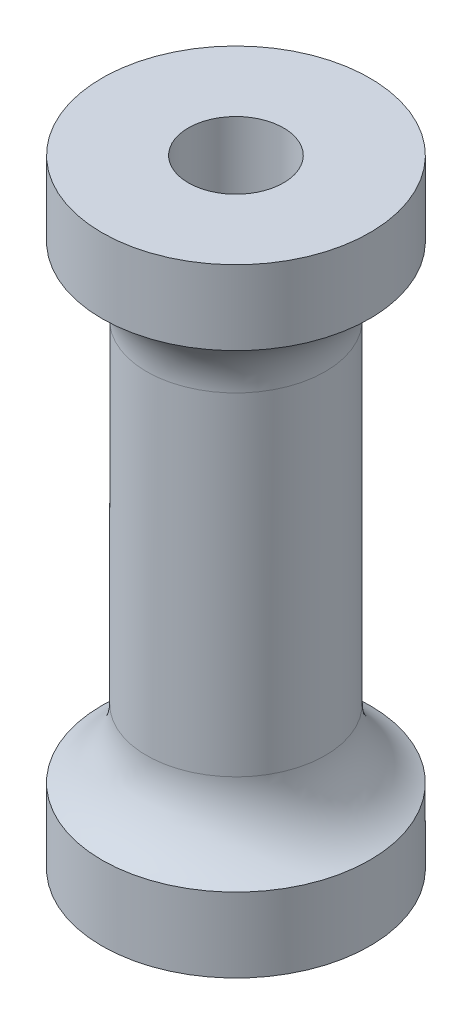
ISO-10303-21;
HEADER;
FILE_DESCRIPTION(('STEP AP214'),'2;1');
FILE_NAME('part.step','',(''),(''),'','','');
FILE_SCHEMA(('AUTOMOTIVE_DESIGN { 1 0 10303 214 1 1 1 1 }'));
ENDSEC;
DATA;
#1=APPLICATION_CONTEXT('core data for automotive mechanical design processes');
#2=APPLICATION_PROTOCOL_DEFINITION('international standard','automotive_design',2000,#1);
#3=PRODUCT_CONTEXT('',#1,'mechanical');
#4=PRODUCT('Part','Part','',(#3));
#5=PRODUCT_RELATED_PRODUCT_CATEGORY('part','',(#4));
#6=PRODUCT_DEFINITION_FORMATION('','',#4);
#7=PRODUCT_DEFINITION_CONTEXT('part definition',#1,'design');
#8=PRODUCT_DEFINITION('design','',#6,#7);
#9=PRODUCT_DEFINITION_SHAPE('','',#8);
#10=(LENGTH_UNIT() NAMED_UNIT(*) SI_UNIT(.MILLI.,.METRE.));
#11=(NAMED_UNIT(*) PLANE_ANGLE_UNIT() SI_UNIT($,.RADIAN.));
#12=(NAMED_UNIT(*) SI_UNIT($,.STERADIAN.) SOLID_ANGLE_UNIT());
#13=UNCERTAINTY_MEASURE_WITH_UNIT(LENGTH_MEASURE(1.E-05),#10,'distance_accuracy_value','');
#14=(GEOMETRIC_REPRESENTATION_CONTEXT(3) GLOBAL_UNCERTAINTY_ASSIGNED_CONTEXT((#13)) GLOBAL_UNIT_ASSIGNED_CONTEXT((#10,
#11,#12)) REPRESENTATION_CONTEXT('',''));
#15=CARTESIAN_POINT('',(0.,0.,0.));
#16=DIRECTION('',(0.,0.,1.));
#17=DIRECTION('',(1.,0.,0.));
#18=AXIS2_PLACEMENT_3D('',#15,#16,#17);
#19=CARTESIAN_POINT('',(0.,41.5,0.));
#20=DIRECTION('',(0.,-1.,0.));
#21=DIRECTION('',(0.,0.,-1.));
#22=AXIS2_PLACEMENT_3D('',#19,#20,#21);
#23=CYLINDRICAL_SURFACE('',#22,6.);
#24=CARTESIAN_POINT('',(0.,31.9174243050442,0.));
#25=DIRECTION('',(0.,1.,0.));
#26=DIRECTION('',(0.,0.,1.));
#27=AXIS2_PLACEMENT_3D('',#24,#25,#26);
#28=CIRCLE('',#27,6.);
#29=CARTESIAN_POINT('',(0.,31.9174243050442,6.));
#30=VERTEX_POINT('',#29);
#31=EDGE_CURVE('E10',#30,#30,#28,.F.);
#32=ORIENTED_EDGE('',*,*,#31,.T.);
#33=EDGE_LOOP('',(#32));
#34=FACE_BOUND('',#33,.T.);
#35=CARTESIAN_POINT('',(0.,9.58257569495584,0.));
#36=DIRECTION('',(0.,-1.,0.));
#37=DIRECTION('',(0.,0.,-1.));
#38=AXIS2_PLACEMENT_3D('',#35,#36,#37);
#39=CIRCLE('',#38,6.);
#40=CARTESIAN_POINT('',(0.,9.58257569495584,-6.));
#41=VERTEX_POINT('',#40);
#42=EDGE_CURVE('E46',#41,#41,#39,.F.);
#43=ORIENTED_EDGE('',*,*,#42,.T.);
#44=EDGE_LOOP('',(#43));
#45=FACE_BOUND('',#44,.T.);
#46=ADVANCED_FACE('F39',(#34,#45),#23,.T.);
#47=CARTESIAN_POINT('',(0.,41.5,0.));
#48=DIRECTION('',(0.,1.,0.));
#49=DIRECTION('',(0.,0.,1.));
#50=AXIS2_PLACEMENT_3D('',#47,#48,#49);
#51=PLANE('',#50);
#52=CARTESIAN_POINT('',(0.,41.5,0.));
#53=DIRECTION('',(0.,1.,0.));
#54=DIRECTION('',(0.,0.,1.));
#55=AXIS2_PLACEMENT_3D('',#52,#53,#54);
#56=CIRCLE('',#55,3.2);
#57=CARTESIAN_POINT('',(0.,41.5,3.2));
#58=VERTEX_POINT('',#57);
#59=EDGE_CURVE('E50',#58,#58,#56,.T.);
#60=ORIENTED_EDGE('',*,*,#59,.F.);
#61=EDGE_LOOP('',(#60));
#62=FACE_BOUND('',#61,.T.);
#63=CARTESIAN_POINT('',(0.,41.5,0.));
#64=DIRECTION('',(0.,1.,0.));
#65=DIRECTION('',(0.,0.,1.));
#66=AXIS2_PLACEMENT_3D('',#63,#64,#65);
#67=CIRCLE('',#66,9.);
#68=CARTESIAN_POINT('',(0.,41.5,9.));
#69=VERTEX_POINT('',#68);
#70=EDGE_CURVE('E58',#69,#69,#67,.T.);
#71=ORIENTED_EDGE('',*,*,#70,.T.);
#72=EDGE_LOOP('',(#71));
#73=FACE_BOUND('',#72,.T.);
#74=ADVANCED_FACE('F84',(#62,#73),#51,.T.);
#75=CARTESIAN_POINT('',(0.,0.,0.));
#76=DIRECTION('',(0.,1.,0.));
#77=DIRECTION('',(0.,0.,1.));
#78=AXIS2_PLACEMENT_3D('',#75,#76,#77);
#79=PLANE('',#78);
#80=CARTESIAN_POINT('',(0.,0.,0.));
#81=DIRECTION('',(0.,1.,0.));
#82=DIRECTION('',(0.,0.,1.));
#83=AXIS2_PLACEMENT_3D('',#80,#81,#82);
#84=CIRCLE('',#83,3.2);
#85=CARTESIAN_POINT('',(0.,0.,3.2));
#86=VERTEX_POINT('',#85);
#87=EDGE_CURVE('E54',#86,#86,#84,.T.);
#88=ORIENTED_EDGE('',*,*,#87,.T.);
#89=EDGE_LOOP('',(#88));
#90=FACE_BOUND('',#89,.T.);
#91=CARTESIAN_POINT('',(0.,0.,0.));
#92=DIRECTION('',(0.,1.,0.));
#93=DIRECTION('',(0.,0.,1.));
#94=AXIS2_PLACEMENT_3D('',#91,#92,#93);
#95=CIRCLE('',#94,9.);
#96=CARTESIAN_POINT('',(0.,0.,9.));
#97=VERTEX_POINT('',#96);
#98=EDGE_CURVE('E65',#97,#97,#95,.T.);
#99=ORIENTED_EDGE('',*,*,#98,.F.);
#100=EDGE_LOOP('',(#99));
#101=FACE_BOUND('',#100,.T.);
#102=ADVANCED_FACE('F81',(#90,#101),#79,.F.);
#103=CARTESIAN_POINT('',(0.,41.5,0.));
#104=DIRECTION('',(0.,-1.,0.));
#105=DIRECTION('',(0.,0.,-1.));
#106=AXIS2_PLACEMENT_3D('',#103,#104,#105);
#107=CYLINDRICAL_SURFACE('',#106,3.2);
#108=ORIENTED_EDGE('',*,*,#59,.T.);
#109=EDGE_LOOP('',(#108));
#110=FACE_BOUND('',#109,.T.);
#111=ORIENTED_EDGE('',*,*,#87,.F.);
#112=EDGE_LOOP('',(#111));
#113=FACE_BOUND('',#112,.T.);
#114=ADVANCED_FACE('F83',(#110,#113),#107,.F.);
#115=CARTESIAN_POINT('',(0.,42.2882716764527,0.));
#116=DIRECTION('',(0.,1.,0.));
#117=DIRECTION('',(0.,0.,1.));
#118=AXIS2_PLACEMENT_3D('',#115,#116,#117);
#119=CYLINDRICAL_SURFACE('',#118,9.);
#120=ORIENTED_EDGE('',*,*,#70,.F.);
#121=EDGE_LOOP('',(#120));
#122=FACE_BOUND('',#121,.T.);
#123=CARTESIAN_POINT('',(0.,36.5,0.));
#124=DIRECTION('',(0.,1.,0.));
#125=DIRECTION('',(0.,0.,1.));
#126=AXIS2_PLACEMENT_3D('',#123,#124,#125);
#127=CIRCLE('',#126,9.);
#128=CARTESIAN_POINT('',(0.,36.5,9.));
#129=VERTEX_POINT('',#128);
#130=EDGE_CURVE('E62',#129,#129,#127,.T.);
#131=ORIENTED_EDGE('',*,*,#130,.T.);
#132=EDGE_LOOP('',(#131));
#133=FACE_BOUND('',#132,.T.);
#134=ADVANCED_FACE('F77',(#122,#133),#119,.T.);
#135=CARTESIAN_POINT('',(0.,42.2882716764527,0.));
#136=DIRECTION('',(0.,1.,0.));
#137=DIRECTION('',(0.,0.,1.));
#138=AXIS2_PLACEMENT_3D('',#135,#136,#137);
#139=CYLINDRICAL_SURFACE('',#138,9.);
#140=CARTESIAN_POINT('',(0.,5.,0.));
#141=DIRECTION('',(0.,1.,0.));
#142=DIRECTION('',(0.,0.,1.));
#143=AXIS2_PLACEMENT_3D('',#140,#141,#142);
#144=CIRCLE('',#143,9.);
#145=CARTESIAN_POINT('',(0.,5.,9.));
#146=VERTEX_POINT('',#145);
#147=EDGE_CURVE('E68',#146,#146,#144,.T.);
#148=ORIENTED_EDGE('',*,*,#147,.F.);
#149=EDGE_LOOP('',(#148));
#150=FACE_BOUND('',#149,.T.);
#151=ORIENTED_EDGE('',*,*,#98,.T.);
#152=EDGE_LOOP('',(#151));
#153=FACE_BOUND('',#152,.T.);
#154=ADVANCED_FACE('F73',(#150,#153),#139,.T.);
#155=CARTESIAN_POINT('',(0.,31.9174243050442,0.));
#156=DIRECTION('',(0.,1.,0.));
#157=DIRECTION('',(0.,0.,1.));
#158=AXIS2_PLACEMENT_3D('',#155,#156,#157);
#159=TOROIDAL_SURFACE('',#158,11.,5.);
#160=ORIENTED_EDGE('',*,*,#31,.F.);
#161=EDGE_LOOP('',(#160));
#162=FACE_BOUND('',#161,.T.);
#163=ORIENTED_EDGE('',*,*,#130,.F.);
#164=EDGE_LOOP('',(#163));
#165=FACE_BOUND('',#164,.T.);
#166=ADVANCED_FACE('F76',(#162,#165),#159,.F.);
#167=CARTESIAN_POINT('',(0.,9.58257569495584,0.));
#168=DIRECTION('',(0.,-1.,0.));
#169=DIRECTION('',(0.,0.,-1.));
#170=AXIS2_PLACEMENT_3D('',#167,#168,#169);
#171=TOROIDAL_SURFACE('',#170,11.,5.);
#172=ORIENTED_EDGE('',*,*,#42,.F.);
#173=EDGE_LOOP('',(#172));
#174=FACE_BOUND('',#173,.T.);
#175=ORIENTED_EDGE('',*,*,#147,.T.);
#176=EDGE_LOOP('',(#175));
#177=FACE_BOUND('',#176,.T.);
#178=ADVANCED_FACE('F41',(#174,#177),#171,.F.);
#179=CLOSED_SHELL('',(#46,#74,#102,#114,#134,#154,#166,#178));
#180=MANIFOLD_SOLID_BREP('B2',#179);
#181=ADVANCED_BREP_SHAPE_REPRESENTATION('',(#18,#180),#14);
#182=SHAPE_DEFINITION_REPRESENTATION(#9,#181);
ENDSEC;
END-ISO-10303-21;
